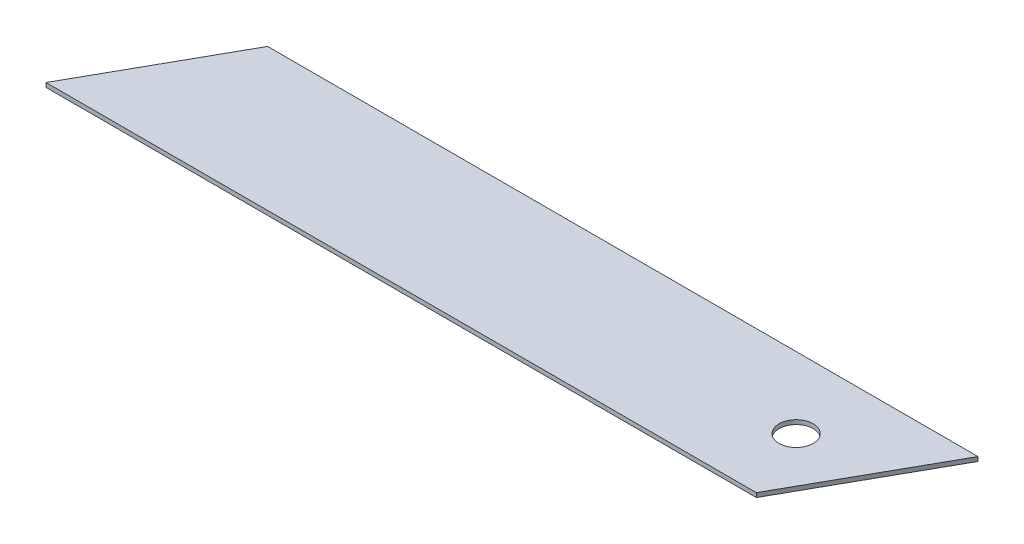
ISO-10303-21;
HEADER;
FILE_DESCRIPTION(('STEP AP214'),'2;1');
FILE_NAME('part.step','',(''),(''),'','','');
FILE_SCHEMA(('AUTOMOTIVE_DESIGN { 1 0 10303 214 1 1 1 1 }'));
ENDSEC;
DATA;
#1=APPLICATION_CONTEXT('core data for automotive mechanical design processes');
#2=APPLICATION_PROTOCOL_DEFINITION('international standard','automotive_design',2000,#1);
#3=PRODUCT_CONTEXT('',#1,'mechanical');
#4=PRODUCT('Part','Part','',(#3));
#5=PRODUCT_RELATED_PRODUCT_CATEGORY('part','',(#4));
#6=PRODUCT_DEFINITION_FORMATION('','',#4);
#7=PRODUCT_DEFINITION_CONTEXT('part definition',#1,'design');
#8=PRODUCT_DEFINITION('design','',#6,#7);
#9=PRODUCT_DEFINITION_SHAPE('','',#8);
#10=(LENGTH_UNIT() NAMED_UNIT(*) SI_UNIT(.MILLI.,.METRE.));
#11=(NAMED_UNIT(*) PLANE_ANGLE_UNIT() SI_UNIT($,.RADIAN.));
#12=(NAMED_UNIT(*) SI_UNIT($,.STERADIAN.) SOLID_ANGLE_UNIT());
#13=UNCERTAINTY_MEASURE_WITH_UNIT(LENGTH_MEASURE(1.E-05),#10,'distance_accuracy_value','');
#14=(GEOMETRIC_REPRESENTATION_CONTEXT(3) GLOBAL_UNCERTAINTY_ASSIGNED_CONTEXT((#13)) GLOBAL_UNIT_ASSIGNED_CONTEXT((#10,
#11,#12)) REPRESENTATION_CONTEXT('',''));
#15=CARTESIAN_POINT('',(0.,0.,0.));
#16=DIRECTION('',(0.,0.,1.));
#17=DIRECTION('',(1.,0.,0.));
#18=AXIS2_PLACEMENT_3D('',#15,#16,#17);
#19=CARTESIAN_POINT('',(0.,0.762,0.));
#20=DIRECTION('',(0.,-1.,0.));
#21=DIRECTION('',(0.,0.,-1.));
#22=AXIS2_PLACEMENT_3D('',#19,#20,#21);
#23=PLANE('',#22);
#24=DIRECTION('',(1.,0.,0.));
#25=VECTOR('',#24,1.);
#26=CARTESIAN_POINT('',(0.,0.762,0.));
#27=LINE('',#26,#25);
#28=CARTESIAN_POINT('',(0.,0.762,0.));
#29=VERTEX_POINT('',#28);
#30=CARTESIAN_POINT('',(127.,0.762,0.));
#31=VERTEX_POINT('',#30);
#32=EDGE_CURVE('E85',#29,#31,#27,.T.);
#33=ORIENTED_EDGE('',*,*,#32,.T.);
#34=DIRECTION('',(0.488603368931844,0.,-0.87250601594972));
#35=VECTOR('',#34,1.);
#36=CARTESIAN_POINT('',(141.224,0.762,-25.4));
#37=LINE('',#36,#35);
#38=CARTESIAN_POINT('',(141.224,0.762,-25.4));
#39=VERTEX_POINT('',#38);
#40=EDGE_CURVE('E80',#31,#39,#37,.T.);
#41=ORIENTED_EDGE('',*,*,#40,.T.);
#42=DIRECTION('',(-1.,0.,0.));
#43=VECTOR('',#42,1.);
#44=CARTESIAN_POINT('',(14.224,0.762,-25.4));
#45=LINE('',#44,#43);
#46=CARTESIAN_POINT('',(14.224,0.762,-25.4));
#47=VERTEX_POINT('',#46);
#48=EDGE_CURVE('E83',#39,#47,#45,.T.);
#49=ORIENTED_EDGE('',*,*,#48,.T.);
#50=DIRECTION('',(-0.488603368931844,0.,0.87250601594972));
#51=VECTOR('',#50,1.);
#52=CARTESIAN_POINT('',(14.224,0.762,-25.4));
#53=LINE('',#52,#51);
#54=EDGE_CURVE('E50',#47,#29,#53,.T.);
#55=ORIENTED_EDGE('',*,*,#54,.T.);
#56=EDGE_LOOP('',(#33,#41,#49,#55));
#57=FACE_BOUND('',#56,.T.);
#58=CARTESIAN_POINT('',(121.412,0.762,-12.7));
#59=DIRECTION('',(0.,1.,0.));
#60=DIRECTION('',(0.,0.,1.));
#61=AXIS2_PLACEMENT_3D('',#58,#59,#60);
#62=CIRCLE('',#61,3.048);
#63=CARTESIAN_POINT('',(121.412,0.762,-15.748));
#64=VERTEX_POINT('',#63);
#65=EDGE_CURVE('E100',#64,#64,#62,.T.);
#66=ORIENTED_EDGE('',*,*,#65,.F.);
#67=EDGE_LOOP('',(#66));
#68=FACE_BOUND('',#67,.T.);
#69=ADVANCED_FACE('F33',(#57,#68),#23,.F.);
#70=CARTESIAN_POINT('',(0.,0.,0.));
#71=DIRECTION('',(0.,-1.,0.));
#72=DIRECTION('',(0.,0.,-1.));
#73=AXIS2_PLACEMENT_3D('',#70,#71,#72);
#74=PLANE('',#73);
#75=DIRECTION('',(1.,0.,0.));
#76=VECTOR('',#75,1.);
#77=CARTESIAN_POINT('',(0.,0.,0.));
#78=LINE('',#77,#76);
#79=CARTESIAN_POINT('',(0.,0.,0.));
#80=VERTEX_POINT('',#79);
#81=CARTESIAN_POINT('',(127.,0.,0.));
#82=VERTEX_POINT('',#81);
#83=EDGE_CURVE('E97',#80,#82,#78,.T.);
#84=ORIENTED_EDGE('',*,*,#83,.F.);
#85=DIRECTION('',(-0.488603368931844,0.,0.87250601594972));
#86=VECTOR('',#85,1.);
#87=CARTESIAN_POINT('',(14.224,0.,-25.4));
#88=LINE('',#87,#86);
#89=CARTESIAN_POINT('',(14.224,0.,-25.4));
#90=VERTEX_POINT('',#89);
#91=EDGE_CURVE('E73',#90,#80,#88,.T.);
#92=ORIENTED_EDGE('',*,*,#91,.F.);
#93=DIRECTION('',(-1.,0.,0.));
#94=VECTOR('',#93,1.);
#95=CARTESIAN_POINT('',(14.224,0.,-25.4));
#96=LINE('',#95,#94);
#97=CARTESIAN_POINT('',(141.224,0.,-25.4));
#98=VERTEX_POINT('',#97);
#99=EDGE_CURVE('E67',#98,#90,#96,.T.);
#100=ORIENTED_EDGE('',*,*,#99,.F.);
#101=DIRECTION('',(0.488603368931844,0.,-0.87250601594972));
#102=VECTOR('',#101,1.);
#103=CARTESIAN_POINT('',(141.224,0.,-25.4));
#104=LINE('',#103,#102);
#105=EDGE_CURVE('E89',#82,#98,#104,.T.);
#106=ORIENTED_EDGE('',*,*,#105,.F.);
#107=EDGE_LOOP('',(#84,#92,#100,#106));
#108=FACE_BOUND('',#107,.T.);
#109=CARTESIAN_POINT('',(121.412,0.,-12.7));
#110=DIRECTION('',(0.,1.,0.));
#111=DIRECTION('',(0.,0.,1.));
#112=AXIS2_PLACEMENT_3D('',#109,#110,#111);
#113=CIRCLE('',#112,3.048);
#114=CARTESIAN_POINT('',(121.412,0.,-15.748));
#115=VERTEX_POINT('',#114);
#116=EDGE_CURVE('E112',#115,#115,#113,.T.);
#117=ORIENTED_EDGE('',*,*,#116,.T.);
#118=EDGE_LOOP('',(#117));
#119=FACE_BOUND('',#118,.T.);
#120=ADVANCED_FACE('F108',(#108,#119),#74,.T.);
#121=CARTESIAN_POINT('',(0.,0.762,0.));
#122=DIRECTION('',(0.,0.,-1.));
#123=DIRECTION('',(-1.,0.,0.));
#124=AXIS2_PLACEMENT_3D('',#121,#122,#123);
#125=PLANE('',#124);
#126=ORIENTED_EDGE('',*,*,#83,.T.);
#127=DIRECTION('',(0.,-1.,0.));
#128=VECTOR('',#127,1.);
#129=CARTESIAN_POINT('',(127.,0.762,0.));
#130=LINE('',#129,#128);
#131=EDGE_CURVE('E11',#31,#82,#130,.T.);
#132=ORIENTED_EDGE('',*,*,#131,.F.);
#133=ORIENTED_EDGE('',*,*,#32,.F.);
#134=DIRECTION('',(0.,-1.,0.));
#135=VECTOR('',#134,1.);
#136=CARTESIAN_POINT('',(0.,0.762,0.));
#137=LINE('',#136,#135);
#138=EDGE_CURVE('E93',#29,#80,#137,.T.);
#139=ORIENTED_EDGE('',*,*,#138,.T.);
#140=EDGE_LOOP('',(#126,#132,#133,#139));
#141=FACE_BOUND('',#140,.T.);
#142=ADVANCED_FACE('F35',(#141),#125,.F.);
#143=CARTESIAN_POINT('',(141.224,0.762,-25.4));
#144=DIRECTION('',(-0.87250601594972,0.,-0.488603368931844));
#145=DIRECTION('',(-0.488603368931844,0.,0.87250601594972));
#146=AXIS2_PLACEMENT_3D('',#143,#144,#145);
#147=PLANE('',#146);
#148=ORIENTED_EDGE('',*,*,#105,.T.);
#149=DIRECTION('',(0.,-1.,0.));
#150=VECTOR('',#149,1.);
#151=CARTESIAN_POINT('',(141.224,0.762,-25.4));
#152=LINE('',#151,#150);
#153=EDGE_CURVE('E42',#39,#98,#152,.T.);
#154=ORIENTED_EDGE('',*,*,#153,.F.);
#155=ORIENTED_EDGE('',*,*,#40,.F.);
#156=ORIENTED_EDGE('',*,*,#131,.T.);
#157=EDGE_LOOP('',(#148,#154,#155,#156));
#158=FACE_BOUND('',#157,.T.);
#159=ADVANCED_FACE('F88',(#158),#147,.F.);
#160=CARTESIAN_POINT('',(14.224,0.762,-25.4));
#161=DIRECTION('',(0.,0.,1.));
#162=DIRECTION('',(1.,0.,0.));
#163=AXIS2_PLACEMENT_3D('',#160,#161,#162);
#164=PLANE('',#163);
#165=ORIENTED_EDGE('',*,*,#99,.T.);
#166=DIRECTION('',(0.,-1.,0.));
#167=VECTOR('',#166,1.);
#168=CARTESIAN_POINT('',(14.224,0.762,-25.4));
#169=LINE('',#168,#167);
#170=EDGE_CURVE('E90',#47,#90,#169,.T.);
#171=ORIENTED_EDGE('',*,*,#170,.F.);
#172=ORIENTED_EDGE('',*,*,#48,.F.);
#173=ORIENTED_EDGE('',*,*,#153,.T.);
#174=EDGE_LOOP('',(#165,#171,#172,#173));
#175=FACE_BOUND('',#174,.T.);
#176=ADVANCED_FACE('F91',(#175),#164,.F.);
#177=CARTESIAN_POINT('',(14.224,0.762,-25.4));
#178=DIRECTION('',(0.87250601594972,0.,0.488603368931844));
#179=DIRECTION('',(0.488603368931844,0.,-0.87250601594972));
#180=AXIS2_PLACEMENT_3D('',#177,#178,#179);
#181=PLANE('',#180);
#182=ORIENTED_EDGE('',*,*,#91,.T.);
#183=ORIENTED_EDGE('',*,*,#138,.F.);
#184=ORIENTED_EDGE('',*,*,#54,.F.);
#185=ORIENTED_EDGE('',*,*,#170,.T.);
#186=EDGE_LOOP('',(#182,#183,#184,#185));
#187=FACE_BOUND('',#186,.T.);
#188=ADVANCED_FACE('F105',(#187),#181,.F.);
#189=CARTESIAN_POINT('',(121.412,0.762,-12.7));
#190=DIRECTION('',(0.,-1.,0.));
#191=DIRECTION('',(0.,0.,-1.));
#192=AXIS2_PLACEMENT_3D('',#189,#190,#191);
#193=CYLINDRICAL_SURFACE('',#192,3.048);
#194=CARTESIAN_POINT('',(121.412,0.762,-15.748));
#195=CARTESIAN_POINT('',(121.412,0.7540625,-15.748));
#196=CARTESIAN_POINT('',(121.412,0.746125,-15.748));
#197=CARTESIAN_POINT('',(121.412,0.73025,-15.748));
#198=CARTESIAN_POINT('',(121.412,0.7223125,-15.748));
#199=CARTESIAN_POINT('',(121.412,0.7064375,-15.748));
#200=CARTESIAN_POINT('',(121.412,0.6985,-15.748));
#201=CARTESIAN_POINT('',(121.412,0.682625,-15.748));
#202=CARTESIAN_POINT('',(121.412,0.6746875,-15.748));
#203=CARTESIAN_POINT('',(121.412,0.6588125,-15.748));
#204=CARTESIAN_POINT('',(121.412,0.650875,-15.748));
#205=CARTESIAN_POINT('',(121.412,0.635,-15.748));
#206=CARTESIAN_POINT('',(121.412,0.6270625,-15.748));
#207=CARTESIAN_POINT('',(121.412,0.6111875,-15.748));
#208=CARTESIAN_POINT('',(121.412,0.60325,-15.748));
#209=CARTESIAN_POINT('',(121.412,0.587375,-15.748));
#210=CARTESIAN_POINT('',(121.412,0.5794375,-15.748));
#211=CARTESIAN_POINT('',(121.412,0.5635625,-15.748));
#212=CARTESIAN_POINT('',(121.412,0.555625,-15.748));
#213=CARTESIAN_POINT('',(121.412,0.53975,-15.748));
#214=CARTESIAN_POINT('',(121.412,0.5318125,-15.748));
#215=CARTESIAN_POINT('',(121.412,0.5159375,-15.748));
#216=CARTESIAN_POINT('',(121.412,0.508,-15.748));
#217=CARTESIAN_POINT('',(121.412,0.492125,-15.748));
#218=CARTESIAN_POINT('',(121.412,0.4841875,-15.748));
#219=CARTESIAN_POINT('',(121.412,0.4683125,-15.748));
#220=CARTESIAN_POINT('',(121.412,0.460375,-15.748));
#221=CARTESIAN_POINT('',(121.412,0.4445,-15.748));
#222=CARTESIAN_POINT('',(121.412,0.4365625,-15.748));
#223=CARTESIAN_POINT('',(121.412,0.4206875,-15.748));
#224=CARTESIAN_POINT('',(121.412,0.41275,-15.748));
#225=CARTESIAN_POINT('',(121.412,0.396875,-15.748));
#226=CARTESIAN_POINT('',(121.412,0.3889375,-15.748));
#227=CARTESIAN_POINT('',(121.412,0.3730625,-15.748));
#228=CARTESIAN_POINT('',(121.412,0.365125,-15.748));
#229=CARTESIAN_POINT('',(121.412,0.34925,-15.748));
#230=CARTESIAN_POINT('',(121.412,0.3413125,-15.748));
#231=CARTESIAN_POINT('',(121.412,0.3254375,-15.748));
#232=CARTESIAN_POINT('',(121.412,0.3175,-15.748));
#233=CARTESIAN_POINT('',(121.412,0.301625,-15.748));
#234=CARTESIAN_POINT('',(121.412,0.2936875,-15.748));
#235=CARTESIAN_POINT('',(121.412,0.2778125,-15.748));
#236=CARTESIAN_POINT('',(121.412,0.269875,-15.748));
#237=CARTESIAN_POINT('',(121.412,0.254,-15.748));
#238=CARTESIAN_POINT('',(121.412,0.2460625,-15.748));
#239=CARTESIAN_POINT('',(121.412,0.2301875,-15.748));
#240=CARTESIAN_POINT('',(121.412,0.22225,-15.748));
#241=CARTESIAN_POINT('',(121.412,0.206375,-15.748));
#242=CARTESIAN_POINT('',(121.412,0.1984375,-15.748));
#243=CARTESIAN_POINT('',(121.412,0.1825625,-15.748));
#244=CARTESIAN_POINT('',(121.412,0.174625,-15.748));
#245=CARTESIAN_POINT('',(121.412,0.15875,-15.748));
#246=CARTESIAN_POINT('',(121.412,0.1508125,-15.748));
#247=CARTESIAN_POINT('',(121.412,0.1349375,-15.748));
#248=CARTESIAN_POINT('',(121.412,0.127,-15.748));
#249=CARTESIAN_POINT('',(121.412,0.111125,-15.748));
#250=CARTESIAN_POINT('',(121.412,0.1031875,-15.748));
#251=CARTESIAN_POINT('',(121.412,0.0873125,-15.748));
#252=CARTESIAN_POINT('',(121.412,0.079375,-15.748));
#253=CARTESIAN_POINT('',(121.412,0.0635,-15.748));
#254=CARTESIAN_POINT('',(121.412,0.0555625,-15.748));
#255=CARTESIAN_POINT('',(121.412,0.0396875,-15.748));
#256=CARTESIAN_POINT('',(121.412,0.03175,-15.748));
#257=CARTESIAN_POINT('',(121.412,0.015875,-15.748));
#258=CARTESIAN_POINT('',(121.412,0.00793749999999999,-15.748));
#259=CARTESIAN_POINT('',(121.412,0.,-15.748));
#260=B_SPLINE_CURVE_WITH_KNOTS('',3,(#194,#195,#196,#197,#198,#199,#200,#201,#202,#203,#204,
#205,#206,#207,#208,#209,#210,#211,#212,#213,#214,#215,#216,#217,#218,#219,#220,#221,#222,#223,
#224,#225,#226,#227,#228,#229,#230,#231,#232,#233,#234,#235,#236,#237,#238,#239,#240,#241,#242,
#243,#244,#245,#246,#247,#248,#249,#250,#251,#252,#253,#254,#255,#256,#257,#258,#259),
.UNSPECIFIED.,.F.,.F.,(4,2,2,2,2,2,2,2,2,2,2,2,2,2,2,2,2,2,2,2,2,2,2,2,2,2,2,2,2,2,2,2,4),(0.,
0.0238125,0.0476249999999999,0.0714374999999999,0.09525,0.1190625,0.142875,0.1666875,0.1905,
0.2143125,0.238125,0.2619375,0.28575,0.3095625,0.333375,0.3571875,0.381,0.4048125,0.428625,
0.4524375,0.47625,0.5000625,0.523875,0.5476875,0.5715,0.5953125,0.619125,0.6429375,0.66675,
0.6905625,0.714375,0.7381875,0.762),.UNSPECIFIED.);
#261=EDGE_CURVE('BSEAM118',#64,#115,#260,.T.);
#262=ORIENTED_EDGE('',*,*,#65,.T.);
#263=ORIENTED_EDGE('',*,*,#116,.F.);
#264=ORIENTED_EDGE('',*,*,#261,.T.);
#265=ORIENTED_EDGE('',*,*,#261,.F.);
#266=EDGE_LOOP('',(#262,#264,#263,#265));
#267=FACE_BOUND('',#266,.T.);
#268=ADVANCED_FACE('F118',(#267),#193,.F.);
#269=CLOSED_SHELL('',(#69,#120,#142,#159,#176,#188,#268));
#270=MANIFOLD_SOLID_BREP('B2',#269);
#271=ADVANCED_BREP_SHAPE_REPRESENTATION('',(#18,#270),#14);
#272=SHAPE_DEFINITION_REPRESENTATION(#9,#271);
ENDSEC;
END-ISO-10303-21;
